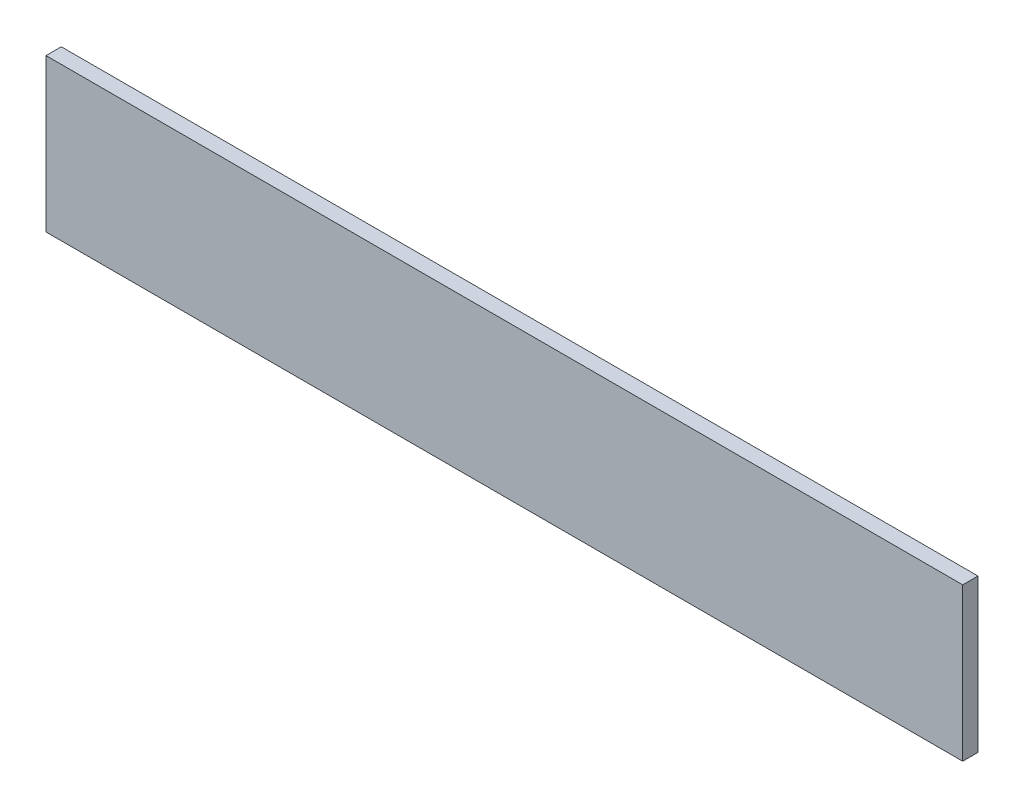
ISO-10303-21;
HEADER;
FILE_DESCRIPTION(('STEP AP214'),'2;1');
FILE_NAME('part.step','',(''),(''),'','','');
FILE_SCHEMA(('AUTOMOTIVE_DESIGN { 1 0 10303 214 1 1 1 1 }'));
ENDSEC;
DATA;
#1=APPLICATION_CONTEXT('core data for automotive mechanical design processes');
#2=APPLICATION_PROTOCOL_DEFINITION('international standard','automotive_design',2000,#1);
#3=PRODUCT_CONTEXT('',#1,'mechanical');
#4=PRODUCT('Part','Part','',(#3));
#5=PRODUCT_RELATED_PRODUCT_CATEGORY('part','',(#4));
#6=PRODUCT_DEFINITION_FORMATION('','',#4);
#7=PRODUCT_DEFINITION_CONTEXT('part definition',#1,'design');
#8=PRODUCT_DEFINITION('design','',#6,#7);
#9=PRODUCT_DEFINITION_SHAPE('','',#8);
#10=(LENGTH_UNIT() NAMED_UNIT(*) SI_UNIT(.MILLI.,.METRE.));
#11=(NAMED_UNIT(*) PLANE_ANGLE_UNIT() SI_UNIT($,.RADIAN.));
#12=(NAMED_UNIT(*) SI_UNIT($,.STERADIAN.) SOLID_ANGLE_UNIT());
#13=UNCERTAINTY_MEASURE_WITH_UNIT(LENGTH_MEASURE(1.E-05),#10,'distance_accuracy_value','');
#14=(GEOMETRIC_REPRESENTATION_CONTEXT(3) GLOBAL_UNCERTAINTY_ASSIGNED_CONTEXT((#13)) GLOBAL_UNIT_ASSIGNED_CONTEXT((#10,
#11,#12)) REPRESENTATION_CONTEXT('',''));
#15=CARTESIAN_POINT('',(0.,0.,0.));
#16=DIRECTION('',(0.,0.,1.));
#17=DIRECTION('',(1.,0.,0.));
#18=AXIS2_PLACEMENT_3D('',#15,#16,#17);
#19=CARTESIAN_POINT('',(-0.2999994,0.0499999,0.));
#20=DIRECTION('',(0.,0.,1.));
#21=DIRECTION('',(1.,0.,0.));
#22=AXIS2_PLACEMENT_3D('',#19,#20,#21);
#23=PLANE('',#22);
#24=DIRECTION('',(0.,1.,0.));
#25=VECTOR('',#24,1.);
#26=CARTESIAN_POINT('',(0.2999994,0.0499999,0.));
#27=LINE('',#26,#25);
#28=CARTESIAN_POINT('',(0.2999994,-0.04999989999999,0.));
#29=VERTEX_POINT('',#28);
#30=CARTESIAN_POINT('',(0.2999994,0.0499999,0.));
#31=VERTEX_POINT('',#30);
#32=EDGE_CURVE('E104',#29,#31,#27,.T.);
#33=ORIENTED_EDGE('',*,*,#32,.F.);
#34=DIRECTION('',(1.,0.,0.));
#35=VECTOR('',#34,1.);
#36=CARTESIAN_POINT('',(-0.2999994,-0.04999989999999,0.));
#37=LINE('',#36,#35);
#38=CARTESIAN_POINT('',(-0.2999994,-0.04999989999999,0.));
#39=VERTEX_POINT('',#38);
#40=EDGE_CURVE('E99',#39,#29,#37,.T.);
#41=ORIENTED_EDGE('',*,*,#40,.F.);
#42=DIRECTION('',(0.,-1.,0.));
#43=VECTOR('',#42,1.);
#44=CARTESIAN_POINT('',(-0.2999994,0.0499999,0.));
#45=LINE('',#44,#43);
#46=CARTESIAN_POINT('',(-0.2999994,0.0499999,0.));
#47=VERTEX_POINT('',#46);
#48=EDGE_CURVE('E21',#47,#39,#45,.T.);
#49=ORIENTED_EDGE('',*,*,#48,.F.);
#50=DIRECTION('',(-1.,0.,0.));
#51=VECTOR('',#50,1.);
#52=CARTESIAN_POINT('',(-0.2999994,0.0499999,0.));
#53=LINE('',#52,#51);
#54=EDGE_CURVE('E11',#31,#47,#53,.T.);
#55=ORIENTED_EDGE('',*,*,#54,.F.);
#56=EDGE_LOOP('',(#33,#41,#49,#55));
#57=FACE_BOUND('',#56,.T.);
#58=ADVANCED_FACE('F17',(#57),#23,.F.);
#59=CARTESIAN_POINT('',(-0.2999994,0.0499999,0.));
#60=DIRECTION('',(0.,1.,0.));
#61=DIRECTION('',(1.,0.,0.));
#62=AXIS2_PLACEMENT_3D('',#59,#60,#61);
#63=PLANE('',#62);
#64=DIRECTION('',(0.,0.,-1.));
#65=VECTOR('',#64,1.);
#66=CARTESIAN_POINT('',(0.2999994,0.0499999,0.));
#67=LINE('',#66,#65);
#68=CARTESIAN_POINT('',(0.2999994,0.0499999,0.01));
#69=VERTEX_POINT('',#68);
#70=EDGE_CURVE('E28',#69,#31,#67,.T.);
#71=ORIENTED_EDGE('',*,*,#70,.T.);
#72=ORIENTED_EDGE('',*,*,#54,.T.);
#73=DIRECTION('',(0.,0.,1.));
#74=VECTOR('',#73,1.);
#75=CARTESIAN_POINT('',(-0.2999994,0.0499999,0.));
#76=LINE('',#75,#74);
#77=CARTESIAN_POINT('',(-0.2999994,0.0499999,0.01));
#78=VERTEX_POINT('',#77);
#79=EDGE_CURVE('E74',#47,#78,#76,.T.);
#80=ORIENTED_EDGE('',*,*,#79,.T.);
#81=DIRECTION('',(1.,0.,0.));
#82=VECTOR('',#81,1.);
#83=CARTESIAN_POINT('',(-0.2999994,0.0499999,0.01));
#84=LINE('',#83,#82);
#85=EDGE_CURVE('E77',#78,#69,#84,.T.);
#86=ORIENTED_EDGE('',*,*,#85,.T.);
#87=EDGE_LOOP('',(#71,#72,#80,#86));
#88=FACE_BOUND('',#87,.T.);
#89=ADVANCED_FACE('F75',(#88),#63,.T.);
#90=CARTESIAN_POINT('',(0.2999994,0.0499999,0.));
#91=DIRECTION('',(1.,0.,0.));
#92=DIRECTION('',(0.,1.,0.));
#93=AXIS2_PLACEMENT_3D('',#90,#91,#92);
#94=PLANE('',#93);
#95=DIRECTION('',(0.,0.,-1.));
#96=VECTOR('',#95,1.);
#97=CARTESIAN_POINT('',(0.2999994,-0.04999989999999,0.));
#98=LINE('',#97,#96);
#99=CARTESIAN_POINT('',(0.2999994,-0.04999989999999,0.01));
#100=VERTEX_POINT('',#99);
#101=EDGE_CURVE('E102',#100,#29,#98,.T.);
#102=ORIENTED_EDGE('',*,*,#101,.T.);
#103=ORIENTED_EDGE('',*,*,#32,.T.);
#104=ORIENTED_EDGE('',*,*,#70,.F.);
#105=DIRECTION('',(0.,-1.,0.));
#106=VECTOR('',#105,1.);
#107=CARTESIAN_POINT('',(0.2999994,0.0499999,0.01));
#108=LINE('',#107,#106);
#109=EDGE_CURVE('E91',#69,#100,#108,.T.);
#110=ORIENTED_EDGE('',*,*,#109,.T.);
#111=EDGE_LOOP('',(#102,#103,#104,#110));
#112=FACE_BOUND('',#111,.T.);
#113=ADVANCED_FACE('F122',(#112),#94,.T.);
#114=CARTESIAN_POINT('',(0.2999994,-0.04999989999999,0.));
#115=DIRECTION('',(0.,-1.,0.));
#116=DIRECTION('',(0.,0.,-1.));
#117=AXIS2_PLACEMENT_3D('',#114,#115,#116);
#118=PLANE('',#117);
#119=DIRECTION('',(0.,0.,-1.));
#120=VECTOR('',#119,1.);
#121=CARTESIAN_POINT('',(-0.2999994,-0.04999989999999,0.));
#122=LINE('',#121,#120);
#123=CARTESIAN_POINT('',(-0.2999994,-0.04999989999999,0.01));
#124=VERTEX_POINT('',#123);
#125=EDGE_CURVE('E65',#124,#39,#122,.T.);
#126=ORIENTED_EDGE('',*,*,#125,.T.);
#127=ORIENTED_EDGE('',*,*,#40,.T.);
#128=ORIENTED_EDGE('',*,*,#101,.F.);
#129=DIRECTION('',(-1.,0.,0.));
#130=VECTOR('',#129,1.);
#131=CARTESIAN_POINT('',(0.2999994,-0.04999989999999,0.01));
#132=LINE('',#131,#130);
#133=EDGE_CURVE('E80',#100,#124,#132,.T.);
#134=ORIENTED_EDGE('',*,*,#133,.T.);
#135=EDGE_LOOP('',(#126,#127,#128,#134));
#136=FACE_BOUND('',#135,.T.);
#137=ADVANCED_FACE('F19',(#136),#118,.T.);
#138=CARTESIAN_POINT('',(-0.2999994,-0.04999989999999,0.));
#139=DIRECTION('',(-1.,0.,0.));
#140=DIRECTION('',(0.,0.,1.));
#141=AXIS2_PLACEMENT_3D('',#138,#139,#140);
#142=PLANE('',#141);
#143=ORIENTED_EDGE('',*,*,#79,.F.);
#144=ORIENTED_EDGE('',*,*,#48,.T.);
#145=ORIENTED_EDGE('',*,*,#125,.F.);
#146=DIRECTION('',(0.,1.,0.));
#147=VECTOR('',#146,1.);
#148=CARTESIAN_POINT('',(-0.2999994,-0.04999989999999,0.01));
#149=LINE('',#148,#147);
#150=EDGE_CURVE('E83',#124,#78,#149,.T.);
#151=ORIENTED_EDGE('',*,*,#150,.T.);
#152=EDGE_LOOP('',(#143,#144,#145,#151));
#153=FACE_BOUND('',#152,.T.);
#154=ADVANCED_FACE('F84',(#153),#142,.T.);
#155=CARTESIAN_POINT('',(-0.2999994,0.0499999,0.01));
#156=DIRECTION('',(0.,0.,1.));
#157=DIRECTION('',(1.,0.,0.));
#158=AXIS2_PLACEMENT_3D('',#155,#156,#157);
#159=PLANE('',#158);
#160=ORIENTED_EDGE('',*,*,#109,.F.);
#161=ORIENTED_EDGE('',*,*,#85,.F.);
#162=ORIENTED_EDGE('',*,*,#150,.F.);
#163=ORIENTED_EDGE('',*,*,#133,.F.);
#164=EDGE_LOOP('',(#160,#161,#162,#163));
#165=FACE_BOUND('',#164,.T.);
#166=ADVANCED_FACE('F89',(#165),#159,.T.);
#167=CLOSED_SHELL('',(#58,#89,#113,#137,#154,#166));
#168=MANIFOLD_SOLID_BREP('B1',#167);
#169=ADVANCED_BREP_SHAPE_REPRESENTATION('',(#18,#168),#14);
#170=SHAPE_DEFINITION_REPRESENTATION(#9,#169);
ENDSEC;
END-ISO-10303-21;
